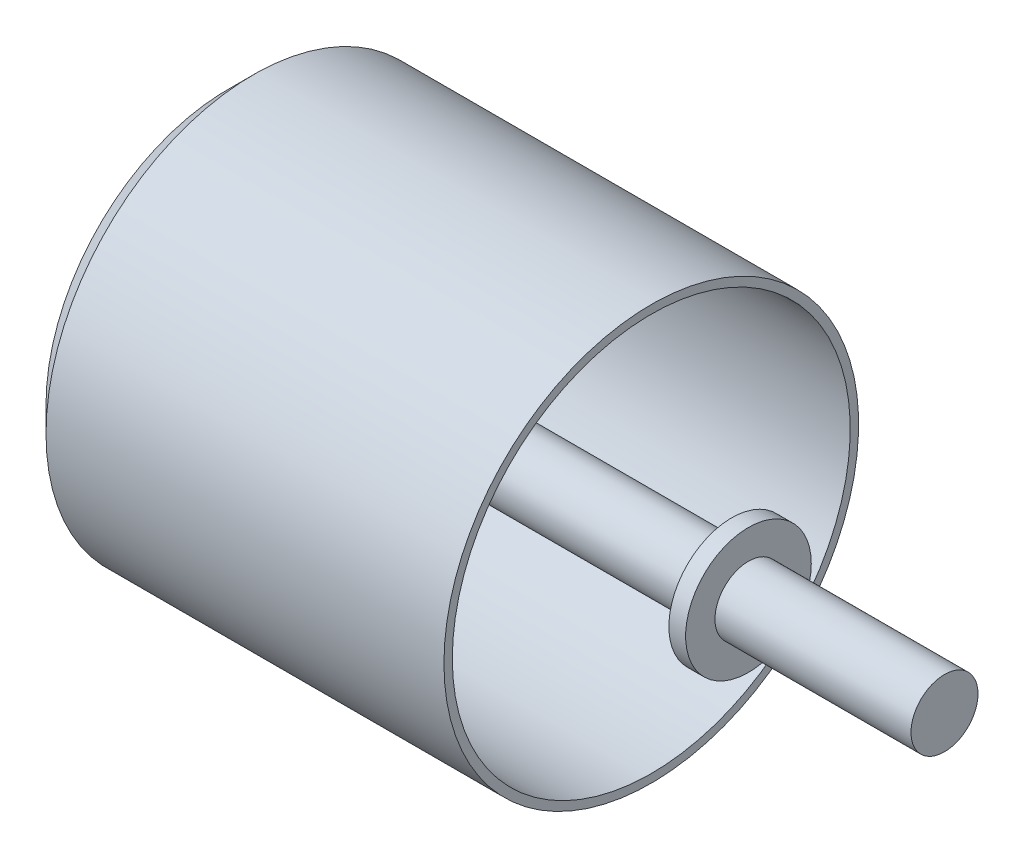
ISO-10303-21;
HEADER;
FILE_DESCRIPTION(('STEP AP214'),'2;1');
FILE_NAME('part.step','',(''),(''),'','','');
FILE_SCHEMA(('AUTOMOTIVE_DESIGN { 1 0 10303 214 1 1 1 1 }'));
ENDSEC;
DATA;
#1=APPLICATION_CONTEXT('core data for automotive mechanical design processes');
#2=APPLICATION_PROTOCOL_DEFINITION('international standard','automotive_design',2000,#1);
#3=PRODUCT_CONTEXT('',#1,'mechanical');
#4=PRODUCT('Part','Part','',(#3));
#5=PRODUCT_RELATED_PRODUCT_CATEGORY('part','',(#4));
#6=PRODUCT_DEFINITION_FORMATION('','',#4);
#7=PRODUCT_DEFINITION_CONTEXT('part definition',#1,'design');
#8=PRODUCT_DEFINITION('design','',#6,#7);
#9=PRODUCT_DEFINITION_SHAPE('','',#8);
#10=(LENGTH_UNIT() NAMED_UNIT(*) SI_UNIT(.MILLI.,.METRE.));
#11=(NAMED_UNIT(*) PLANE_ANGLE_UNIT() SI_UNIT($,.RADIAN.));
#12=(NAMED_UNIT(*) SI_UNIT($,.STERADIAN.) SOLID_ANGLE_UNIT());
#13=UNCERTAINTY_MEASURE_WITH_UNIT(LENGTH_MEASURE(1.E-05),#10,'distance_accuracy_value','');
#14=(GEOMETRIC_REPRESENTATION_CONTEXT(3) GLOBAL_UNCERTAINTY_ASSIGNED_CONTEXT((#13)) GLOBAL_UNIT_ASSIGNED_CONTEXT((#10,
#11,#12)) REPRESENTATION_CONTEXT('',''));
#15=CARTESIAN_POINT('',(0.,0.,0.));
#16=DIRECTION('',(0.,0.,1.));
#17=DIRECTION('',(1.,0.,0.));
#18=AXIS2_PLACEMENT_3D('',#15,#16,#17);
#19=CARTESIAN_POINT('',(85.5,0.,0.));
#20=DIRECTION('',(-1.,0.,0.));
#21=DIRECTION('',(0.,0.,1.));
#22=AXIS2_PLACEMENT_3D('',#19,#20,#21);
#23=CYLINDRICAL_SURFACE('',#22,4.);
#24=CARTESIAN_POINT('',(1.,0.,0.));
#25=DIRECTION('',(-1.,0.,0.));
#26=DIRECTION('',(0.,0.,1.));
#27=AXIS2_PLACEMENT_3D('',#24,#25,#26);
#28=CIRCLE('',#27,4.);
#29=CARTESIAN_POINT('',(1.,0.,4.));
#30=VERTEX_POINT('',#29);
#31=EDGE_CURVE('E47',#30,#30,#28,.F.);
#32=ORIENTED_EDGE('',*,*,#31,.T.);
#33=EDGE_LOOP('',(#32));
#34=FACE_BOUND('',#33,.T.);
#35=CARTESIAN_POINT('',(60.1,0.,0.));
#36=DIRECTION('',(1.,0.,0.));
#37=DIRECTION('',(0.,0.,-1.));
#38=AXIS2_PLACEMENT_3D('',#35,#36,#37);
#39=CIRCLE('',#38,4.);
#40=CARTESIAN_POINT('',(60.1,0.,-4.));
#41=VERTEX_POINT('',#40);
#42=EDGE_CURVE('E10',#41,#41,#39,.T.);
#43=ORIENTED_EDGE('',*,*,#42,.F.);
#44=EDGE_LOOP('',(#43));
#45=FACE_BOUND('',#44,.T.);
#46=ADVANCED_FACE('F39',(#34,#45),#23,.T.);
#47=CARTESIAN_POINT('',(1.,0.,0.));
#48=DIRECTION('',(-1.,0.,0.));
#49=DIRECTION('',(0.,0.,1.));
#50=AXIS2_PLACEMENT_3D('',#47,#48,#49);
#51=PLANE('',#50);
#52=CARTESIAN_POINT('',(1.,17.,0.));
#53=DIRECTION('',(-1.,0.,0.));
#54=DIRECTION('',(0.,0.,1.));
#55=AXIS2_PLACEMENT_3D('',#52,#53,#54);
#56=CIRCLE('',#55,3.5);
#57=CARTESIAN_POINT('',(1.,17.,3.5));
#58=VERTEX_POINT('',#57);
#59=EDGE_CURVE('E74',#58,#58,#56,.T.);
#60=ORIENTED_EDGE('',*,*,#59,.T.);
#61=EDGE_LOOP('',(#60));
#62=FACE_BOUND('',#61,.T.);
#63=CARTESIAN_POINT('',(1.,0.,17.));
#64=DIRECTION('',(-1.,0.,0.));
#65=DIRECTION('',(0.,0.,1.));
#66=AXIS2_PLACEMENT_3D('',#63,#64,#65);
#67=CIRCLE('',#66,3.5);
#68=CARTESIAN_POINT('',(1.,0.,20.5));
#69=VERTEX_POINT('',#68);
#70=EDGE_CURVE('E77',#69,#69,#67,.T.);
#71=ORIENTED_EDGE('',*,*,#70,.T.);
#72=EDGE_LOOP('',(#71));
#73=FACE_BOUND('',#72,.T.);
#74=CARTESIAN_POINT('',(1.,-17.,0.));
#75=DIRECTION('',(-1.,0.,0.));
#76=DIRECTION('',(0.,0.,1.));
#77=AXIS2_PLACEMENT_3D('',#74,#75,#76);
#78=CIRCLE('',#77,3.5);
#79=CARTESIAN_POINT('',(1.,-17.,3.5));
#80=VERTEX_POINT('',#79);
#81=EDGE_CURVE('E80',#80,#80,#78,.T.);
#82=ORIENTED_EDGE('',*,*,#81,.T.);
#83=EDGE_LOOP('',(#82));
#84=FACE_BOUND('',#83,.T.);
#85=CARTESIAN_POINT('',(1.,0.,-17.));
#86=DIRECTION('',(-1.,0.,0.));
#87=DIRECTION('',(0.,0.,1.));
#88=AXIS2_PLACEMENT_3D('',#85,#86,#87);
#89=CIRCLE('',#88,3.5);
#90=CARTESIAN_POINT('',(1.,0.,-13.5));
#91=VERTEX_POINT('',#90);
#92=EDGE_CURVE('E83',#91,#91,#89,.T.);
#93=ORIENTED_EDGE('',*,*,#92,.T.);
#94=EDGE_LOOP('',(#93));
#95=FACE_BOUND('',#94,.T.);
#96=ORIENTED_EDGE('',*,*,#31,.F.);
#97=EDGE_LOOP('',(#96));
#98=FACE_BOUND('',#97,.T.);
#99=CARTESIAN_POINT('',(1.,0.,0.));
#100=DIRECTION('',(-1.,0.,0.));
#101=DIRECTION('',(0.,0.,1.));
#102=AXIS2_PLACEMENT_3D('',#99,#100,#101);
#103=CIRCLE('',#102,21.3357864376269);
#104=CARTESIAN_POINT('',(1.,0.,21.3357864376269));
#105=VERTEX_POINT('',#104);
#106=EDGE_CURVE('E51',#105,#105,#103,.T.);
#107=ORIENTED_EDGE('',*,*,#106,.F.);
#108=EDGE_LOOP('',(#107));
#109=FACE_BOUND('',#108,.T.);
#110=ADVANCED_FACE('F41',(#62,#73,#84,#95,#98,#109),#51,.F.);
#111=CARTESIAN_POINT('',(1.,0.,0.));
#112=DIRECTION('',(1.,0.,0.));
#113=DIRECTION('',(0.,0.,-1.));
#114=AXIS2_PLACEMENT_3D('',#111,#112,#113);
#115=CONICAL_SURFACE('',#114,21.3357864376269,0.785398163397449);
#116=CARTESIAN_POINT('',(3.41421356237309,0.,0.));
#117=DIRECTION('',(-1.,0.,0.));
#118=DIRECTION('',(0.,0.,1.));
#119=AXIS2_PLACEMENT_3D('',#116,#117,#118);
#120=CIRCLE('',#119,23.75);
#121=CARTESIAN_POINT('',(3.41421356237309,0.,23.75));
#122=VERTEX_POINT('',#121);
#123=EDGE_CURVE('E56',#122,#122,#120,.T.);
#124=ORIENTED_EDGE('',*,*,#123,.F.);
#125=EDGE_LOOP('',(#124));
#126=FACE_BOUND('',#125,.T.);
#127=ORIENTED_EDGE('',*,*,#106,.T.);
#128=EDGE_LOOP('',(#127));
#129=FACE_BOUND('',#128,.T.);
#130=ADVANCED_FACE('F133',(#126,#129),#115,.F.);
#131=CARTESIAN_POINT('',(0.,0.,0.));
#132=DIRECTION('',(-1.,0.,0.));
#133=DIRECTION('',(0.,0.,1.));
#134=AXIS2_PLACEMENT_3D('',#131,#132,#133);
#135=CYLINDRICAL_SURFACE('',#134,23.75);
#136=CARTESIAN_POINT('',(50.5,0.,0.));
#137=DIRECTION('',(-1.,0.,0.));
#138=DIRECTION('',(0.,0.,1.));
#139=AXIS2_PLACEMENT_3D('',#136,#137,#138);
#140=CIRCLE('',#139,23.75);
#141=CARTESIAN_POINT('',(50.5,0.,23.75));
#142=VERTEX_POINT('',#141);
#143=EDGE_CURVE('E59',#142,#142,#140,.T.);
#144=ORIENTED_EDGE('',*,*,#143,.F.);
#145=EDGE_LOOP('',(#144));
#146=FACE_BOUND('',#145,.T.);
#147=ORIENTED_EDGE('',*,*,#123,.T.);
#148=EDGE_LOOP('',(#147));
#149=FACE_BOUND('',#148,.T.);
#150=ADVANCED_FACE('F179',(#146,#149),#135,.F.);
#151=CARTESIAN_POINT('',(50.5,23.75,0.));
#152=DIRECTION('',(-1.,0.,0.));
#153=DIRECTION('',(0.,0.,1.));
#154=AXIS2_PLACEMENT_3D('',#151,#152,#153);
#155=PLANE('',#154);
#156=CARTESIAN_POINT('',(50.5,0.,0.));
#157=DIRECTION('',(-1.,0.,0.));
#158=DIRECTION('',(0.,0.,1.));
#159=AXIS2_PLACEMENT_3D('',#156,#157,#158);
#160=CIRCLE('',#159,24.75);
#161=CARTESIAN_POINT('',(50.5,0.,24.75));
#162=VERTEX_POINT('',#161);
#163=EDGE_CURVE('E62',#162,#162,#160,.T.);
#164=ORIENTED_EDGE('',*,*,#163,.F.);
#165=EDGE_LOOP('',(#164));
#166=FACE_BOUND('',#165,.T.);
#167=ORIENTED_EDGE('',*,*,#143,.T.);
#168=EDGE_LOOP('',(#167));
#169=FACE_BOUND('',#168,.T.);
#170=ADVANCED_FACE('F184',(#166,#169),#155,.F.);
#171=CARTESIAN_POINT('',(0.,0.,0.));
#172=DIRECTION('',(-1.,0.,0.));
#173=DIRECTION('',(0.,0.,1.));
#174=AXIS2_PLACEMENT_3D('',#171,#172,#173);
#175=CYLINDRICAL_SURFACE('',#174,24.75);
#176=CARTESIAN_POINT('',(3.,0.,0.));
#177=DIRECTION('',(-1.,0.,0.));
#178=DIRECTION('',(0.,0.,1.));
#179=AXIS2_PLACEMENT_3D('',#176,#177,#178);
#180=CIRCLE('',#179,24.75);
#181=CARTESIAN_POINT('',(3.,0.,24.75));
#182=VERTEX_POINT('',#181);
#183=EDGE_CURVE('E65',#182,#182,#180,.T.);
#184=ORIENTED_EDGE('',*,*,#183,.F.);
#185=EDGE_LOOP('',(#184));
#186=FACE_BOUND('',#185,.T.);
#187=ORIENTED_EDGE('',*,*,#163,.T.);
#188=EDGE_LOOP('',(#187));
#189=FACE_BOUND('',#188,.T.);
#190=ADVANCED_FACE('F191',(#186,#189),#175,.T.);
#191=CARTESIAN_POINT('',(3.,0.,0.));
#192=DIRECTION('',(1.,0.,0.));
#193=DIRECTION('',(0.,0.,-1.));
#194=AXIS2_PLACEMENT_3D('',#191,#192,#193);
#195=CONICAL_SURFACE('',#194,24.75,0.78539816339745);
#196=CARTESIAN_POINT('',(0.,0.,0.));
#197=DIRECTION('',(-1.,0.,0.));
#198=DIRECTION('',(0.,0.,1.));
#199=AXIS2_PLACEMENT_3D('',#196,#197,#198);
#200=CIRCLE('',#199,21.75);
#201=CARTESIAN_POINT('',(0.,0.,21.75));
#202=VERTEX_POINT('',#201);
#203=EDGE_CURVE('E68',#202,#202,#200,.T.);
#204=ORIENTED_EDGE('',*,*,#203,.F.);
#205=EDGE_LOOP('',(#204));
#206=FACE_BOUND('',#205,.T.);
#207=ORIENTED_EDGE('',*,*,#183,.T.);
#208=EDGE_LOOP('',(#207));
#209=FACE_BOUND('',#208,.T.);
#210=ADVANCED_FACE('F195',(#206,#209),#195,.T.);
#211=CARTESIAN_POINT('',(0.,0.,0.));
#212=DIRECTION('',(1.,0.,0.));
#213=DIRECTION('',(0.,0.,-1.));
#214=AXIS2_PLACEMENT_3D('',#211,#212,#213);
#215=PLANE('',#214);
#216=CARTESIAN_POINT('',(0.,17.,0.));
#217=DIRECTION('',(-1.,0.,0.));
#218=DIRECTION('',(0.,0.,1.));
#219=AXIS2_PLACEMENT_3D('',#216,#217,#218);
#220=CIRCLE('',#219,3.5);
#221=CARTESIAN_POINT('',(0.,17.,3.5));
#222=VERTEX_POINT('',#221);
#223=EDGE_CURVE('E86',#222,#222,#220,.T.);
#224=ORIENTED_EDGE('',*,*,#223,.F.);
#225=EDGE_LOOP('',(#224));
#226=FACE_BOUND('',#225,.T.);
#227=CARTESIAN_POINT('',(0.,0.,17.));
#228=DIRECTION('',(-1.,0.,0.));
#229=DIRECTION('',(0.,0.,1.));
#230=AXIS2_PLACEMENT_3D('',#227,#228,#229);
#231=CIRCLE('',#230,3.5);
#232=CARTESIAN_POINT('',(0.,0.,20.5));
#233=VERTEX_POINT('',#232);
#234=EDGE_CURVE('E93',#233,#233,#231,.T.);
#235=ORIENTED_EDGE('',*,*,#234,.F.);
#236=EDGE_LOOP('',(#235));
#237=FACE_BOUND('',#236,.T.);
#238=CARTESIAN_POINT('',(0.,-17.,0.));
#239=DIRECTION('',(-1.,0.,0.));
#240=DIRECTION('',(0.,0.,1.));
#241=AXIS2_PLACEMENT_3D('',#238,#239,#240);
#242=CIRCLE('',#241,3.5);
#243=CARTESIAN_POINT('',(0.,-17.,3.5));
#244=VERTEX_POINT('',#243);
#245=EDGE_CURVE('E90',#244,#244,#242,.T.);
#246=ORIENTED_EDGE('',*,*,#245,.F.);
#247=EDGE_LOOP('',(#246));
#248=FACE_BOUND('',#247,.T.);
#249=CARTESIAN_POINT('',(0.,0.,-17.));
#250=DIRECTION('',(-1.,0.,0.));
#251=DIRECTION('',(0.,0.,1.));
#252=AXIS2_PLACEMENT_3D('',#249,#250,#251);
#253=CIRCLE('',#252,3.5);
#254=CARTESIAN_POINT('',(0.,0.,-13.5));
#255=VERTEX_POINT('',#254);
#256=EDGE_CURVE('E87',#255,#255,#253,.T.);
#257=ORIENTED_EDGE('',*,*,#256,.F.);
#258=EDGE_LOOP('',(#257));
#259=FACE_BOUND('',#258,.T.);
#260=ORIENTED_EDGE('',*,*,#203,.T.);
#261=EDGE_LOOP('',(#260));
#262=FACE_BOUND('',#261,.T.);
#263=ADVANCED_FACE('F151',(#226,#237,#248,#259,#262),#215,.F.);
#264=CARTESIAN_POINT('',(85.5,0.,-17.));
#265=DIRECTION('',(-1.,0.,0.));
#266=DIRECTION('',(0.,0.,1.));
#267=AXIS2_PLACEMENT_3D('',#264,#265,#266);
#268=CYLINDRICAL_SURFACE('',#267,3.5);
#269=ORIENTED_EDGE('',*,*,#256,.T.);
#270=EDGE_LOOP('',(#269));
#271=FACE_BOUND('',#270,.T.);
#272=ORIENTED_EDGE('',*,*,#92,.F.);
#273=EDGE_LOOP('',(#272));
#274=FACE_BOUND('',#273,.T.);
#275=ADVANCED_FACE('F148',(#271,#274),#268,.F.);
#276=CARTESIAN_POINT('',(85.5,-17.,0.));
#277=DIRECTION('',(-1.,0.,0.));
#278=DIRECTION('',(0.,0.,1.));
#279=AXIS2_PLACEMENT_3D('',#276,#277,#278);
#280=CYLINDRICAL_SURFACE('',#279,3.5);
#281=ORIENTED_EDGE('',*,*,#245,.T.);
#282=EDGE_LOOP('',(#281));
#283=FACE_BOUND('',#282,.T.);
#284=ORIENTED_EDGE('',*,*,#81,.F.);
#285=EDGE_LOOP('',(#284));
#286=FACE_BOUND('',#285,.T.);
#287=ADVANCED_FACE('F150',(#283,#286),#280,.F.);
#288=CARTESIAN_POINT('',(85.5,0.,17.));
#289=DIRECTION('',(-1.,0.,0.));
#290=DIRECTION('',(0.,0.,1.));
#291=AXIS2_PLACEMENT_3D('',#288,#289,#290);
#292=CYLINDRICAL_SURFACE('',#291,3.5);
#293=ORIENTED_EDGE('',*,*,#234,.T.);
#294=EDGE_LOOP('',(#293));
#295=FACE_BOUND('',#294,.T.);
#296=ORIENTED_EDGE('',*,*,#70,.F.);
#297=EDGE_LOOP('',(#296));
#298=FACE_BOUND('',#297,.T.);
#299=ADVANCED_FACE('F155',(#295,#298),#292,.F.);
#300=CARTESIAN_POINT('',(85.5,17.,0.));
#301=DIRECTION('',(-1.,0.,0.));
#302=DIRECTION('',(0.,0.,1.));
#303=AXIS2_PLACEMENT_3D('',#300,#301,#302);
#304=CYLINDRICAL_SURFACE('',#303,3.5);
#305=ORIENTED_EDGE('',*,*,#223,.T.);
#306=EDGE_LOOP('',(#305));
#307=FACE_BOUND('',#306,.T.);
#308=ORIENTED_EDGE('',*,*,#59,.F.);
#309=EDGE_LOOP('',(#308));
#310=FACE_BOUND('',#309,.T.);
#311=ADVANCED_FACE('F122',(#307,#310),#304,.F.);
#312=CARTESIAN_POINT('',(62.1,0.,0.));
#313=DIRECTION('',(-1.,0.,0.));
#314=DIRECTION('',(0.,0.,1.));
#315=AXIS2_PLACEMENT_3D('',#312,#313,#314);
#316=CYLINDRICAL_SURFACE('',#315,7.5);
#317=CARTESIAN_POINT('',(62.1,0.,0.));
#318=DIRECTION('',(1.,0.,0.));
#319=DIRECTION('',(0.,0.,-1.));
#320=AXIS2_PLACEMENT_3D('',#317,#318,#319);
#321=CIRCLE('',#320,7.5);
#322=CARTESIAN_POINT('',(62.1,0.,-7.5));
#323=VERTEX_POINT('',#322);
#324=EDGE_CURVE('E101',#323,#323,#321,.T.);
#325=ORIENTED_EDGE('',*,*,#324,.F.);
#326=EDGE_LOOP('',(#325));
#327=FACE_BOUND('',#326,.T.);
#328=CARTESIAN_POINT('',(60.1,0.,0.));
#329=DIRECTION('',(1.,0.,0.));
#330=DIRECTION('',(0.,0.,-1.));
#331=AXIS2_PLACEMENT_3D('',#328,#329,#330);
#332=CIRCLE('',#331,7.5);
#333=CARTESIAN_POINT('',(60.1,0.,-7.5));
#334=VERTEX_POINT('',#333);
#335=EDGE_CURVE('E98',#334,#334,#332,.T.);
#336=ORIENTED_EDGE('',*,*,#335,.T.);
#337=EDGE_LOOP('',(#336));
#338=FACE_BOUND('',#337,.T.);
#339=ADVANCED_FACE('F114',(#327,#338),#316,.T.);
#340=CARTESIAN_POINT('',(62.1,0.,0.));
#341=DIRECTION('',(1.,0.,0.));
#342=DIRECTION('',(0.,0.,-1.));
#343=AXIS2_PLACEMENT_3D('',#340,#341,#342);
#344=PLANE('',#343);
#345=CARTESIAN_POINT('',(62.1,0.,0.));
#346=DIRECTION('',(1.,0.,0.));
#347=DIRECTION('',(0.,0.,-1.));
#348=AXIS2_PLACEMENT_3D('',#345,#346,#347);
#349=CIRCLE('',#348,4.);
#350=CARTESIAN_POINT('',(62.1,0.,-4.));
#351=VERTEX_POINT('',#350);
#352=EDGE_CURVE('E43',#351,#351,#349,.T.);
#353=ORIENTED_EDGE('',*,*,#352,.F.);
#354=EDGE_LOOP('',(#353));
#355=FACE_BOUND('',#354,.T.);
#356=ORIENTED_EDGE('',*,*,#324,.T.);
#357=EDGE_LOOP('',(#356));
#358=FACE_BOUND('',#357,.T.);
#359=ADVANCED_FACE('F111',(#355,#358),#344,.T.);
#360=CARTESIAN_POINT('',(60.1,0.,0.));
#361=DIRECTION('',(1.,0.,0.));
#362=DIRECTION('',(0.,0.,-1.));
#363=AXIS2_PLACEMENT_3D('',#360,#361,#362);
#364=PLANE('',#363);
#365=ORIENTED_EDGE('',*,*,#42,.T.);
#366=EDGE_LOOP('',(#365));
#367=FACE_BOUND('',#366,.T.);
#368=ORIENTED_EDGE('',*,*,#335,.F.);
#369=EDGE_LOOP('',(#368));
#370=FACE_BOUND('',#369,.T.);
#371=ADVANCED_FACE('F113',(#367,#370),#364,.F.);
#372=CARTESIAN_POINT('',(85.5,0.,0.));
#373=DIRECTION('',(1.,0.,0.));
#374=DIRECTION('',(0.,0.,-1.));
#375=AXIS2_PLACEMENT_3D('',#372,#373,#374);
#376=PLANE('',#375);
#377=CARTESIAN_POINT('',(85.5,0.,0.));
#378=DIRECTION('',(1.,0.,0.));
#379=DIRECTION('',(0.,0.,-1.));
#380=AXIS2_PLACEMENT_3D('',#377,#378,#379);
#381=CIRCLE('',#380,4.);
#382=CARTESIAN_POINT('',(85.5,0.,-4.));
#383=VERTEX_POINT('',#382);
#384=EDGE_CURVE('E70',#383,#383,#381,.T.);
#385=ORIENTED_EDGE('',*,*,#384,.T.);
#386=EDGE_LOOP('',(#385));
#387=FACE_BOUND('',#386,.T.);
#388=ADVANCED_FACE('F120',(#387),#376,.T.);
#389=ORIENTED_EDGE('',*,*,#352,.T.);
#390=EDGE_LOOP('',(#389));
#391=FACE_BOUND('',#390,.T.);
#392=ORIENTED_EDGE('',*,*,#384,.F.);
#393=EDGE_LOOP('',(#392));
#394=FACE_BOUND('',#393,.T.);
#395=ADVANCED_FACE('F108',(#391,#394),#23,.T.);
#396=CLOSED_SHELL('',(#46,#110,#130,#150,#170,#190,#210,#263,#275,#287,#299,#311,#339,#359,#371,
#388,#395));
#397=MANIFOLD_SOLID_BREP('B2',#396);
#398=ADVANCED_BREP_SHAPE_REPRESENTATION('',(#18,#397),#14);
#399=SHAPE_DEFINITION_REPRESENTATION(#9,#398);
ENDSEC;
END-ISO-10303-21;
